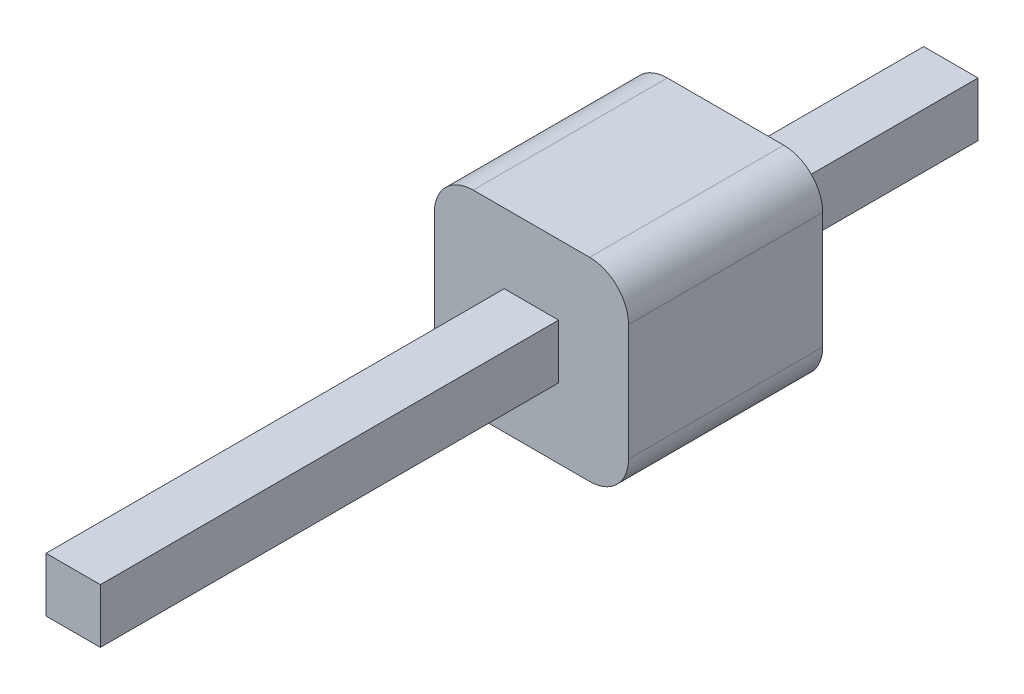
ISO-10303-21;
HEADER;
FILE_DESCRIPTION(('STEP AP214'),'2;1');
FILE_NAME('part.step','',(''),(''),'','','');
FILE_SCHEMA(('AUTOMOTIVE_DESIGN { 1 0 10303 214 1 1 1 1 }'));
ENDSEC;
DATA;
#1=APPLICATION_CONTEXT('core data for automotive mechanical design processes');
#2=APPLICATION_PROTOCOL_DEFINITION('international standard','automotive_design',2000,#1);
#3=PRODUCT_CONTEXT('',#1,'mechanical');
#4=PRODUCT('Part','Part','',(#3));
#5=PRODUCT_RELATED_PRODUCT_CATEGORY('part','',(#4));
#6=PRODUCT_DEFINITION_FORMATION('','',#4);
#7=PRODUCT_DEFINITION_CONTEXT('part definition',#1,'design');
#8=PRODUCT_DEFINITION('design','',#6,#7);
#9=PRODUCT_DEFINITION_SHAPE('','',#8);
#10=(LENGTH_UNIT() NAMED_UNIT(*) SI_UNIT(.MILLI.,.METRE.));
#11=(NAMED_UNIT(*) PLANE_ANGLE_UNIT() SI_UNIT($,.RADIAN.));
#12=(NAMED_UNIT(*) SI_UNIT($,.STERADIAN.) SOLID_ANGLE_UNIT());
#13=UNCERTAINTY_MEASURE_WITH_UNIT(LENGTH_MEASURE(1.E-05),#10,'distance_accuracy_value','');
#14=(GEOMETRIC_REPRESENTATION_CONTEXT(3) GLOBAL_UNCERTAINTY_ASSIGNED_CONTEXT((#13)) GLOBAL_UNIT_ASSIGNED_CONTEXT((#10,
#11,#12)) REPRESENTATION_CONTEXT('',''));
#15=CARTESIAN_POINT('',(0.,0.,0.));
#16=DIRECTION('',(0.,0.,1.));
#17=DIRECTION('',(1.,0.,0.));
#18=AXIS2_PLACEMENT_3D('',#15,#16,#17);
#19=CARTESIAN_POINT('',(-0.35,-0.35,11.3));
#20=DIRECTION('',(1.,0.,0.));
#21=DIRECTION('',(0.,0.,-1.));
#22=AXIS2_PLACEMENT_3D('',#19,#20,#21);
#23=PLANE('',#22);
#24=DIRECTION('',(0.,1.,0.));
#25=VECTOR('',#24,1.);
#26=CARTESIAN_POINT('',(-0.35,-0.35,5.4));
#27=LINE('',#26,#25);
#28=CARTESIAN_POINT('',(-0.35,-0.35,5.4));
#29=VERTEX_POINT('',#28);
#30=CARTESIAN_POINT('',(-0.35,0.35,5.4));
#31=VERTEX_POINT('',#30);
#32=EDGE_CURVE('E11',#29,#31,#27,.T.);
#33=ORIENTED_EDGE('',*,*,#32,.F.);
#34=DIRECTION('',(0.,0.,-1.));
#35=VECTOR('',#34,1.);
#36=CARTESIAN_POINT('',(-0.35,-0.35,11.3));
#37=LINE('',#36,#35);
#38=CARTESIAN_POINT('',(-0.35,-0.35,11.3));
#39=VERTEX_POINT('',#38);
#40=EDGE_CURVE('E24',#39,#29,#37,.T.);
#41=ORIENTED_EDGE('',*,*,#40,.F.);
#42=DIRECTION('',(0.,-1.,0.));
#43=VECTOR('',#42,1.);
#44=CARTESIAN_POINT('',(-0.35,-0.35,11.3));
#45=LINE('',#44,#43);
#46=CARTESIAN_POINT('',(-0.35,0.35,11.3));
#47=VERTEX_POINT('',#46);
#48=EDGE_CURVE('E253',#47,#39,#45,.T.);
#49=ORIENTED_EDGE('',*,*,#48,.F.);
#50=DIRECTION('',(0.,0.,-1.));
#51=VECTOR('',#50,1.);
#52=CARTESIAN_POINT('',(-0.35,0.35,11.3));
#53=LINE('',#52,#51);
#54=EDGE_CURVE('E251',#47,#31,#53,.T.);
#55=ORIENTED_EDGE('',*,*,#54,.T.);
#56=EDGE_LOOP('',(#33,#41,#49,#55));
#57=FACE_BOUND('',#56,.T.);
#58=ADVANCED_FACE('F17',(#57),#23,.F.);
#59=CARTESIAN_POINT('',(0.35,-0.35,11.3));
#60=DIRECTION('',(0.,1.,0.));
#61=DIRECTION('',(-1.,0.,0.));
#62=AXIS2_PLACEMENT_3D('',#59,#60,#61);
#63=PLANE('',#62);
#64=DIRECTION('',(-1.,0.,0.));
#65=VECTOR('',#64,1.);
#66=CARTESIAN_POINT('',(0.35,-0.35,5.4));
#67=LINE('',#66,#65);
#68=CARTESIAN_POINT('',(0.35,-0.35,5.4));
#69=VERTEX_POINT('',#68);
#70=EDGE_CURVE('E249',#69,#29,#67,.T.);
#71=ORIENTED_EDGE('',*,*,#70,.F.);
#72=DIRECTION('',(0.,0.,-1.));
#73=VECTOR('',#72,1.);
#74=CARTESIAN_POINT('',(0.35,-0.35,11.3));
#75=LINE('',#74,#73);
#76=CARTESIAN_POINT('',(0.35,-0.35,11.3));
#77=VERTEX_POINT('',#76);
#78=EDGE_CURVE('E246',#77,#69,#75,.T.);
#79=ORIENTED_EDGE('',*,*,#78,.F.);
#80=DIRECTION('',(1.,0.,0.));
#81=VECTOR('',#80,1.);
#82=CARTESIAN_POINT('',(0.35,-0.35,11.3));
#83=LINE('',#82,#81);
#84=EDGE_CURVE('E243',#39,#77,#83,.T.);
#85=ORIENTED_EDGE('',*,*,#84,.F.);
#86=ORIENTED_EDGE('',*,*,#40,.T.);
#87=EDGE_LOOP('',(#71,#79,#85,#86));
#88=FACE_BOUND('',#87,.T.);
#89=ADVANCED_FACE('F257',(#88),#63,.F.);
#90=CARTESIAN_POINT('',(0.35,-0.35,11.3));
#91=DIRECTION('',(-1.,0.,0.));
#92=DIRECTION('',(0.,0.,1.));
#93=AXIS2_PLACEMENT_3D('',#90,#91,#92);
#94=PLANE('',#93);
#95=DIRECTION('',(0.,-1.,0.));
#96=VECTOR('',#95,1.);
#97=CARTESIAN_POINT('',(0.35,-0.35,5.4));
#98=LINE('',#97,#96);
#99=CARTESIAN_POINT('',(0.35,0.35,5.4));
#100=VERTEX_POINT('',#99);
#101=EDGE_CURVE('E240',#100,#69,#98,.T.);
#102=ORIENTED_EDGE('',*,*,#101,.F.);
#103=DIRECTION('',(0.,0.,-1.));
#104=VECTOR('',#103,1.);
#105=CARTESIAN_POINT('',(0.35,0.35,11.3));
#106=LINE('',#105,#104);
#107=CARTESIAN_POINT('',(0.35,0.35,11.3));
#108=VERTEX_POINT('',#107);
#109=EDGE_CURVE('E237',#108,#100,#106,.T.);
#110=ORIENTED_EDGE('',*,*,#109,.F.);
#111=DIRECTION('',(0.,1.,0.));
#112=VECTOR('',#111,1.);
#113=CARTESIAN_POINT('',(0.35,-0.35,11.3));
#114=LINE('',#113,#112);
#115=EDGE_CURVE('E234',#77,#108,#114,.T.);
#116=ORIENTED_EDGE('',*,*,#115,.F.);
#117=ORIENTED_EDGE('',*,*,#78,.T.);
#118=EDGE_LOOP('',(#102,#110,#116,#117));
#119=FACE_BOUND('',#118,.T.);
#120=ADVANCED_FACE('F261',(#119),#94,.F.);
#121=CARTESIAN_POINT('',(0.35,0.35,11.3));
#122=DIRECTION('',(0.,-1.,0.));
#123=DIRECTION('',(1.,0.,0.));
#124=AXIS2_PLACEMENT_3D('',#121,#122,#123);
#125=PLANE('',#124);
#126=DIRECTION('',(1.,0.,0.));
#127=VECTOR('',#126,1.);
#128=CARTESIAN_POINT('',(0.35,0.35,5.4));
#129=LINE('',#128,#127);
#130=EDGE_CURVE('E232',#31,#100,#129,.T.);
#131=ORIENTED_EDGE('',*,*,#130,.F.);
#132=ORIENTED_EDGE('',*,*,#54,.F.);
#133=DIRECTION('',(-1.,0.,0.));
#134=VECTOR('',#133,1.);
#135=CARTESIAN_POINT('',(0.35,0.35,11.3));
#136=LINE('',#135,#134);
#137=EDGE_CURVE('E229',#108,#47,#136,.T.);
#138=ORIENTED_EDGE('',*,*,#137,.F.);
#139=ORIENTED_EDGE('',*,*,#109,.T.);
#140=EDGE_LOOP('',(#131,#132,#138,#139));
#141=FACE_BOUND('',#140,.T.);
#142=ADVANCED_FACE('F265',(#141),#125,.F.);
#143=CARTESIAN_POINT('',(0.,0.,11.3));
#144=DIRECTION('',(0.,0.,1.));
#145=DIRECTION('',(1.,0.,0.));
#146=AXIS2_PLACEMENT_3D('',#143,#144,#145);
#147=PLANE('',#146);
#148=ORIENTED_EDGE('',*,*,#48,.T.);
#149=ORIENTED_EDGE('',*,*,#84,.T.);
#150=ORIENTED_EDGE('',*,*,#115,.T.);
#151=ORIENTED_EDGE('',*,*,#137,.T.);
#152=EDGE_LOOP('',(#148,#149,#150,#151));
#153=FACE_BOUND('',#152,.T.);
#154=ADVANCED_FACE('F268',(#153),#147,.T.);
#155=CARTESIAN_POINT('',(0.,0.,5.4));
#156=DIRECTION('',(0.,0.,-1.));
#157=DIRECTION('',(-1.,0.,0.));
#158=AXIS2_PLACEMENT_3D('',#155,#156,#157);
#159=PLANE('',#158);
#160=DIRECTION('',(0.,1.,0.));
#161=VECTOR('',#160,1.);
#162=CARTESIAN_POINT('',(-1.25,-1.25,5.4));
#163=LINE('',#162,#161);
#164=CARTESIAN_POINT('',(-1.25,-0.75,5.4));
#165=VERTEX_POINT('',#164);
#166=CARTESIAN_POINT('',(-1.25,0.75,5.4));
#167=VERTEX_POINT('',#166);
#168=EDGE_CURVE('E227',#165,#167,#163,.T.);
#169=ORIENTED_EDGE('',*,*,#168,.F.);
#170=CARTESIAN_POINT('',(-0.75,-0.75,5.4));
#171=DIRECTION('',(0.,0.,1.));
#172=DIRECTION('',(-1.,0.,0.));
#173=AXIS2_PLACEMENT_3D('',#170,#171,#172);
#174=CIRCLE('',#173,0.5);
#175=CARTESIAN_POINT('',(-0.75,-1.25,5.4));
#176=VERTEX_POINT('',#175);
#177=EDGE_CURVE('E225',#165,#176,#174,.T.);
#178=ORIENTED_EDGE('',*,*,#177,.T.);
#179=DIRECTION('',(-1.,0.,0.));
#180=VECTOR('',#179,1.);
#181=CARTESIAN_POINT('',(-1.25,-1.25,5.4));
#182=LINE('',#181,#180);
#183=CARTESIAN_POINT('',(0.75,-1.25,5.4));
#184=VERTEX_POINT('',#183);
#185=EDGE_CURVE('E222',#184,#176,#182,.T.);
#186=ORIENTED_EDGE('',*,*,#185,.F.);
#187=CARTESIAN_POINT('',(0.75,-0.75,5.4));
#188=DIRECTION('',(0.,0.,1.));
#189=DIRECTION('',(-1.,0.,0.));
#190=AXIS2_PLACEMENT_3D('',#187,#188,#189);
#191=CIRCLE('',#190,0.5);
#192=CARTESIAN_POINT('',(1.25,-0.75,5.4));
#193=VERTEX_POINT('',#192);
#194=EDGE_CURVE('E220',#184,#193,#191,.T.);
#195=ORIENTED_EDGE('',*,*,#194,.T.);
#196=DIRECTION('',(0.,-1.,0.));
#197=VECTOR('',#196,1.);
#198=CARTESIAN_POINT('',(1.25,-1.25,5.4));
#199=LINE('',#198,#197);
#200=CARTESIAN_POINT('',(1.25,0.75,5.4));
#201=VERTEX_POINT('',#200);
#202=EDGE_CURVE('E217',#201,#193,#199,.T.);
#203=ORIENTED_EDGE('',*,*,#202,.F.);
#204=CARTESIAN_POINT('',(0.75,0.75,5.4));
#205=DIRECTION('',(0.,0.,1.));
#206=DIRECTION('',(-1.,0.,0.));
#207=AXIS2_PLACEMENT_3D('',#204,#205,#206);
#208=CIRCLE('',#207,0.5);
#209=CARTESIAN_POINT('',(0.75,1.25,5.4));
#210=VERTEX_POINT('',#209);
#211=EDGE_CURVE('E215',#201,#210,#208,.T.);
#212=ORIENTED_EDGE('',*,*,#211,.T.);
#213=DIRECTION('',(1.,0.,0.));
#214=VECTOR('',#213,1.);
#215=CARTESIAN_POINT('',(-1.25,1.25,5.4));
#216=LINE('',#215,#214);
#217=CARTESIAN_POINT('',(-0.75,1.25,5.4));
#218=VERTEX_POINT('',#217);
#219=EDGE_CURVE('E212',#218,#210,#216,.T.);
#220=ORIENTED_EDGE('',*,*,#219,.F.);
#221=CARTESIAN_POINT('',(-0.75,0.75,5.4));
#222=DIRECTION('',(0.,0.,1.));
#223=DIRECTION('',(-1.,0.,0.));
#224=AXIS2_PLACEMENT_3D('',#221,#222,#223);
#225=CIRCLE('',#224,0.5);
#226=EDGE_CURVE('E209',#218,#167,#225,.T.);
#227=ORIENTED_EDGE('',*,*,#226,.T.);
#228=EDGE_LOOP('',(#169,#178,#186,#195,#203,#212,#220,#227));
#229=FACE_BOUND('',#228,.T.);
#230=ORIENTED_EDGE('',*,*,#70,.T.);
#231=ORIENTED_EDGE('',*,*,#32,.T.);
#232=ORIENTED_EDGE('',*,*,#130,.T.);
#233=ORIENTED_EDGE('',*,*,#101,.T.);
#234=EDGE_LOOP('',(#230,#231,#232,#233));
#235=FACE_BOUND('',#234,.T.);
#236=ADVANCED_FACE('F258',(#229,#235),#159,.F.);
#237=CARTESIAN_POINT('',(0.,0.,2.9));
#238=DIRECTION('',(0.,0.,-1.));
#239=DIRECTION('',(-1.,0.,0.));
#240=AXIS2_PLACEMENT_3D('',#237,#238,#239);
#241=PLANE('',#240);
#242=DIRECTION('',(-1.,0.,0.));
#243=VECTOR('',#242,1.);
#244=CARTESIAN_POINT('',(-1.25,-1.25,2.9));
#245=LINE('',#244,#243);
#246=CARTESIAN_POINT('',(0.75,-1.25,2.9));
#247=VERTEX_POINT('',#246);
#248=CARTESIAN_POINT('',(-0.75,-1.25,2.9));
#249=VERTEX_POINT('',#248);
#250=EDGE_CURVE('E207',#247,#249,#245,.T.);
#251=ORIENTED_EDGE('',*,*,#250,.T.);
#252=CARTESIAN_POINT('',(-0.75,-0.75,2.9));
#253=DIRECTION('',(0.,0.,-1.));
#254=DIRECTION('',(-1.,0.,0.));
#255=AXIS2_PLACEMENT_3D('',#252,#253,#254);
#256=CIRCLE('',#255,0.5);
#257=CARTESIAN_POINT('',(-1.25,-0.75,2.9));
#258=VERTEX_POINT('',#257);
#259=EDGE_CURVE('E205',#249,#258,#256,.T.);
#260=ORIENTED_EDGE('',*,*,#259,.T.);
#261=DIRECTION('',(0.,1.,0.));
#262=VECTOR('',#261,1.);
#263=CARTESIAN_POINT('',(-1.25,-1.25,2.9));
#264=LINE('',#263,#262);
#265=CARTESIAN_POINT('',(-1.25,0.75,2.9));
#266=VERTEX_POINT('',#265);
#267=EDGE_CURVE('E203',#258,#266,#264,.T.);
#268=ORIENTED_EDGE('',*,*,#267,.T.);
#269=CARTESIAN_POINT('',(-0.75,0.75,2.9));
#270=DIRECTION('',(0.,0.,-1.));
#271=DIRECTION('',(-1.,0.,0.));
#272=AXIS2_PLACEMENT_3D('',#269,#270,#271);
#273=CIRCLE('',#272,0.5);
#274=CARTESIAN_POINT('',(-0.75,1.25,2.9));
#275=VERTEX_POINT('',#274);
#276=EDGE_CURVE('E201',#266,#275,#273,.T.);
#277=ORIENTED_EDGE('',*,*,#276,.T.);
#278=DIRECTION('',(1.,0.,0.));
#279=VECTOR('',#278,1.);
#280=CARTESIAN_POINT('',(-1.25,1.25,2.9));
#281=LINE('',#280,#279);
#282=CARTESIAN_POINT('',(0.75,1.25,2.9));
#283=VERTEX_POINT('',#282);
#284=EDGE_CURVE('E199',#275,#283,#281,.T.);
#285=ORIENTED_EDGE('',*,*,#284,.T.);
#286=CARTESIAN_POINT('',(0.75,0.75,2.9));
#287=DIRECTION('',(0.,0.,-1.));
#288=DIRECTION('',(-1.,0.,0.));
#289=AXIS2_PLACEMENT_3D('',#286,#287,#288);
#290=CIRCLE('',#289,0.5);
#291=CARTESIAN_POINT('',(1.25,0.75,2.9));
#292=VERTEX_POINT('',#291);
#293=EDGE_CURVE('E197',#283,#292,#290,.T.);
#294=ORIENTED_EDGE('',*,*,#293,.T.);
#295=DIRECTION('',(0.,-1.,0.));
#296=VECTOR('',#295,1.);
#297=CARTESIAN_POINT('',(1.25,-1.25,2.9));
#298=LINE('',#297,#296);
#299=CARTESIAN_POINT('',(1.25,-0.75,2.9));
#300=VERTEX_POINT('',#299);
#301=EDGE_CURVE('E195',#292,#300,#298,.T.);
#302=ORIENTED_EDGE('',*,*,#301,.T.);
#303=CARTESIAN_POINT('',(0.75,-0.75,2.9));
#304=DIRECTION('',(0.,0.,-1.));
#305=DIRECTION('',(-1.,0.,0.));
#306=AXIS2_PLACEMENT_3D('',#303,#304,#305);
#307=CIRCLE('',#306,0.5);
#308=EDGE_CURVE('E192',#300,#247,#307,.T.);
#309=ORIENTED_EDGE('',*,*,#308,.T.);
#310=EDGE_LOOP('',(#251,#260,#268,#277,#285,#294,#302,#309));
#311=FACE_BOUND('',#310,.T.);
#312=DIRECTION('',(0.,1.,0.));
#313=VECTOR('',#312,1.);
#314=CARTESIAN_POINT('',(-0.35,-0.35,2.9));
#315=LINE('',#314,#313);
#316=CARTESIAN_POINT('',(-0.35,-0.35,2.9));
#317=VERTEX_POINT('',#316);
#318=CARTESIAN_POINT('',(-0.35,0.35,2.9));
#319=VERTEX_POINT('',#318);
#320=EDGE_CURVE('E190',#317,#319,#315,.T.);
#321=ORIENTED_EDGE('',*,*,#320,.F.);
#322=DIRECTION('',(-1.,0.,0.));
#323=VECTOR('',#322,1.);
#324=CARTESIAN_POINT('',(0.35,-0.35,2.9));
#325=LINE('',#324,#323);
#326=CARTESIAN_POINT('',(0.35,-0.35,2.9));
#327=VERTEX_POINT('',#326);
#328=EDGE_CURVE('E188',#327,#317,#325,.T.);
#329=ORIENTED_EDGE('',*,*,#328,.F.);
#330=DIRECTION('',(0.,-1.,0.));
#331=VECTOR('',#330,1.);
#332=CARTESIAN_POINT('',(0.35,-0.35,2.9));
#333=LINE('',#332,#331);
#334=CARTESIAN_POINT('',(0.35,0.35,2.9));
#335=VERTEX_POINT('',#334);
#336=EDGE_CURVE('E149',#335,#327,#333,.T.);
#337=ORIENTED_EDGE('',*,*,#336,.F.);
#338=DIRECTION('',(1.,0.,0.));
#339=VECTOR('',#338,1.);
#340=CARTESIAN_POINT('',(0.35,0.35,2.9));
#341=LINE('',#340,#339);
#342=EDGE_CURVE('E184',#319,#335,#341,.T.);
#343=ORIENTED_EDGE('',*,*,#342,.F.);
#344=EDGE_LOOP('',(#321,#329,#337,#343));
#345=FACE_BOUND('',#344,.T.);
#346=ADVANCED_FACE('F285',(#311,#345),#241,.T.);
#347=CARTESIAN_POINT('',(1.25,-1.25,5.4));
#348=DIRECTION('',(1.,0.,0.));
#349=DIRECTION('',(0.,0.,-1.));
#350=AXIS2_PLACEMENT_3D('',#347,#348,#349);
#351=PLANE('',#350);
#352=ORIENTED_EDGE('',*,*,#301,.F.);
#353=DIRECTION('',(0.,0.,1.));
#354=VECTOR('',#353,1.);
#355=CARTESIAN_POINT('',(1.25,0.75,5.4));
#356=LINE('',#355,#354);
#357=EDGE_CURVE('E181',#292,#201,#356,.T.);
#358=ORIENTED_EDGE('',*,*,#357,.T.);
#359=ORIENTED_EDGE('',*,*,#202,.T.);
#360=DIRECTION('',(0.,0.,-1.));
#361=VECTOR('',#360,1.);
#362=CARTESIAN_POINT('',(1.25,-0.75,5.4));
#363=LINE('',#362,#361);
#364=EDGE_CURVE('E178',#193,#300,#363,.T.);
#365=ORIENTED_EDGE('',*,*,#364,.T.);
#366=EDGE_LOOP('',(#352,#358,#359,#365));
#367=FACE_BOUND('',#366,.T.);
#368=ADVANCED_FACE('F289',(#367),#351,.T.);
#369=CARTESIAN_POINT('',(-1.25,1.25,5.4));
#370=DIRECTION('',(0.,1.,0.));
#371=DIRECTION('',(0.,0.,1.));
#372=AXIS2_PLACEMENT_3D('',#369,#370,#371);
#373=PLANE('',#372);
#374=ORIENTED_EDGE('',*,*,#284,.F.);
#375=DIRECTION('',(0.,0.,1.));
#376=VECTOR('',#375,1.);
#377=CARTESIAN_POINT('',(-0.75,1.25,5.4));
#378=LINE('',#377,#376);
#379=EDGE_CURVE('E175',#275,#218,#378,.T.);
#380=ORIENTED_EDGE('',*,*,#379,.T.);
#381=ORIENTED_EDGE('',*,*,#219,.T.);
#382=DIRECTION('',(0.,0.,-1.));
#383=VECTOR('',#382,1.);
#384=CARTESIAN_POINT('',(0.75,1.25,5.4));
#385=LINE('',#384,#383);
#386=EDGE_CURVE('E172',#210,#283,#385,.T.);
#387=ORIENTED_EDGE('',*,*,#386,.T.);
#388=EDGE_LOOP('',(#374,#380,#381,#387));
#389=FACE_BOUND('',#388,.T.);
#390=ADVANCED_FACE('F293',(#389),#373,.T.);
#391=CARTESIAN_POINT('',(-1.25,-1.25,5.4));
#392=DIRECTION('',(-1.,0.,0.));
#393=DIRECTION('',(0.,0.,1.));
#394=AXIS2_PLACEMENT_3D('',#391,#392,#393);
#395=PLANE('',#394);
#396=ORIENTED_EDGE('',*,*,#267,.F.);
#397=DIRECTION('',(0.,0.,1.));
#398=VECTOR('',#397,1.);
#399=CARTESIAN_POINT('',(-1.25,-0.75,5.4));
#400=LINE('',#399,#398);
#401=EDGE_CURVE('E169',#258,#165,#400,.T.);
#402=ORIENTED_EDGE('',*,*,#401,.T.);
#403=ORIENTED_EDGE('',*,*,#168,.T.);
#404=DIRECTION('',(0.,0.,-1.));
#405=VECTOR('',#404,1.);
#406=CARTESIAN_POINT('',(-1.25,0.75,5.4));
#407=LINE('',#406,#405);
#408=EDGE_CURVE('E166',#167,#266,#407,.T.);
#409=ORIENTED_EDGE('',*,*,#408,.T.);
#410=EDGE_LOOP('',(#396,#402,#403,#409));
#411=FACE_BOUND('',#410,.T.);
#412=ADVANCED_FACE('F297',(#411),#395,.T.);
#413=CARTESIAN_POINT('',(-1.25,-1.25,5.4));
#414=DIRECTION('',(0.,-1.,0.));
#415=DIRECTION('',(1.,0.,0.));
#416=AXIS2_PLACEMENT_3D('',#413,#414,#415);
#417=PLANE('',#416);
#418=ORIENTED_EDGE('',*,*,#185,.T.);
#419=DIRECTION('',(0.,0.,-1.));
#420=VECTOR('',#419,1.);
#421=CARTESIAN_POINT('',(-0.75,-1.25,5.4));
#422=LINE('',#421,#420);
#423=EDGE_CURVE('E163',#176,#249,#422,.T.);
#424=ORIENTED_EDGE('',*,*,#423,.T.);
#425=ORIENTED_EDGE('',*,*,#250,.F.);
#426=DIRECTION('',(0.,0.,1.));
#427=VECTOR('',#426,1.);
#428=CARTESIAN_POINT('',(0.75,-1.25,5.4));
#429=LINE('',#428,#427);
#430=EDGE_CURVE('E160',#247,#184,#429,.T.);
#431=ORIENTED_EDGE('',*,*,#430,.T.);
#432=EDGE_LOOP('',(#418,#424,#425,#431));
#433=FACE_BOUND('',#432,.T.);
#434=ADVANCED_FACE('F301',(#433),#417,.T.);
#435=CARTESIAN_POINT('',(0.,0.,0.));
#436=DIRECTION('',(0.,0.,1.));
#437=DIRECTION('',(1.,0.,0.));
#438=AXIS2_PLACEMENT_3D('',#435,#436,#437);
#439=PLANE('',#438);
#440=DIRECTION('',(0.,-1.,0.));
#441=VECTOR('',#440,1.);
#442=CARTESIAN_POINT('',(-0.35,-0.35,0.));
#443=LINE('',#442,#441);
#444=CARTESIAN_POINT('',(-0.35,0.35,0.));
#445=VERTEX_POINT('',#444);
#446=CARTESIAN_POINT('',(-0.35,-0.35,0.));
#447=VERTEX_POINT('',#446);
#448=EDGE_CURVE('E158',#445,#447,#443,.T.);
#449=ORIENTED_EDGE('',*,*,#448,.F.);
#450=DIRECTION('',(-1.,0.,0.));
#451=VECTOR('',#450,1.);
#452=CARTESIAN_POINT('',(0.35,0.35,0.));
#453=LINE('',#452,#451);
#454=CARTESIAN_POINT('',(0.35,0.35,0.));
#455=VERTEX_POINT('',#454);
#456=EDGE_CURVE('E132',#455,#445,#453,.T.);
#457=ORIENTED_EDGE('',*,*,#456,.F.);
#458=DIRECTION('',(0.,1.,0.));
#459=VECTOR('',#458,1.);
#460=CARTESIAN_POINT('',(0.35,-0.35,0.));
#461=LINE('',#460,#459);
#462=CARTESIAN_POINT('',(0.35,-0.35,0.));
#463=VERTEX_POINT('',#462);
#464=EDGE_CURVE('E126',#463,#455,#461,.T.);
#465=ORIENTED_EDGE('',*,*,#464,.F.);
#466=DIRECTION('',(1.,0.,0.));
#467=VECTOR('',#466,1.);
#468=CARTESIAN_POINT('',(0.35,-0.35,0.));
#469=LINE('',#468,#467);
#470=EDGE_CURVE('E129',#447,#463,#469,.T.);
#471=ORIENTED_EDGE('',*,*,#470,.F.);
#472=EDGE_LOOP('',(#449,#457,#465,#471));
#473=FACE_BOUND('',#472,.T.);
#474=ADVANCED_FACE('F128',(#473),#439,.F.);
#475=CARTESIAN_POINT('',(0.35,0.35,11.3));
#476=DIRECTION('',(0.,-1.,0.));
#477=DIRECTION('',(1.,0.,0.));
#478=AXIS2_PLACEMENT_3D('',#475,#476,#477);
#479=PLANE('',#478);
#480=DIRECTION('',(0.,0.,-1.));
#481=VECTOR('',#480,1.);
#482=CARTESIAN_POINT('',(-0.35,0.35,11.3));
#483=LINE('',#482,#481);
#484=EDGE_CURVE('E145',#319,#445,#483,.T.);
#485=ORIENTED_EDGE('',*,*,#484,.F.);
#486=ORIENTED_EDGE('',*,*,#342,.T.);
#487=DIRECTION('',(0.,0.,-1.));
#488=VECTOR('',#487,1.);
#489=CARTESIAN_POINT('',(0.35,0.35,11.3));
#490=LINE('',#489,#488);
#491=EDGE_CURVE('E150',#335,#455,#490,.T.);
#492=ORIENTED_EDGE('',*,*,#491,.T.);
#493=ORIENTED_EDGE('',*,*,#456,.T.);
#494=EDGE_LOOP('',(#485,#486,#492,#493));
#495=FACE_BOUND('',#494,.T.);
#496=ADVANCED_FACE('F308',(#495),#479,.F.);
#497=CARTESIAN_POINT('',(0.35,-0.35,11.3));
#498=DIRECTION('',(-1.,0.,0.));
#499=DIRECTION('',(0.,0.,1.));
#500=AXIS2_PLACEMENT_3D('',#497,#498,#499);
#501=PLANE('',#500);
#502=ORIENTED_EDGE('',*,*,#491,.F.);
#503=ORIENTED_EDGE('',*,*,#336,.T.);
#504=DIRECTION('',(0.,0.,-1.));
#505=VECTOR('',#504,1.);
#506=CARTESIAN_POINT('',(0.35,-0.35,11.3));
#507=LINE('',#506,#505);
#508=EDGE_CURVE('E142',#327,#463,#507,.T.);
#509=ORIENTED_EDGE('',*,*,#508,.T.);
#510=ORIENTED_EDGE('',*,*,#464,.T.);
#511=EDGE_LOOP('',(#502,#503,#509,#510));
#512=FACE_BOUND('',#511,.T.);
#513=ADVANCED_FACE('F148',(#512),#501,.F.);
#514=CARTESIAN_POINT('',(0.35,-0.35,11.3));
#515=DIRECTION('',(0.,1.,0.));
#516=DIRECTION('',(-1.,0.,0.));
#517=AXIS2_PLACEMENT_3D('',#514,#515,#516);
#518=PLANE('',#517);
#519=ORIENTED_EDGE('',*,*,#508,.F.);
#520=ORIENTED_EDGE('',*,*,#328,.T.);
#521=DIRECTION('',(0.,0.,-1.));
#522=VECTOR('',#521,1.);
#523=CARTESIAN_POINT('',(-0.35,-0.35,11.3));
#524=LINE('',#523,#522);
#525=EDGE_CURVE('E144',#317,#447,#524,.T.);
#526=ORIENTED_EDGE('',*,*,#525,.T.);
#527=ORIENTED_EDGE('',*,*,#470,.T.);
#528=EDGE_LOOP('',(#519,#520,#526,#527));
#529=FACE_BOUND('',#528,.T.);
#530=ADVANCED_FACE('F140',(#529),#518,.F.);
#531=CARTESIAN_POINT('',(-0.35,-0.35,11.3));
#532=DIRECTION('',(1.,0.,0.));
#533=DIRECTION('',(0.,0.,-1.));
#534=AXIS2_PLACEMENT_3D('',#531,#532,#533);
#535=PLANE('',#534);
#536=ORIENTED_EDGE('',*,*,#525,.F.);
#537=ORIENTED_EDGE('',*,*,#320,.T.);
#538=ORIENTED_EDGE('',*,*,#484,.T.);
#539=ORIENTED_EDGE('',*,*,#448,.T.);
#540=EDGE_LOOP('',(#536,#537,#538,#539));
#541=FACE_BOUND('',#540,.T.);
#542=ADVANCED_FACE('F316',(#541),#535,.F.);
#543=CARTESIAN_POINT('',(-0.75,-0.75,5.4));
#544=DIRECTION('',(0.,0.,-1.));
#545=DIRECTION('',(-1.,0.,0.));
#546=AXIS2_PLACEMENT_3D('',#543,#544,#545);
#547=CYLINDRICAL_SURFACE('',#546,0.5);
#548=ORIENTED_EDGE('',*,*,#177,.F.);
#549=ORIENTED_EDGE('',*,*,#401,.F.);
#550=ORIENTED_EDGE('',*,*,#259,.F.);
#551=ORIENTED_EDGE('',*,*,#423,.F.);
#552=EDGE_LOOP('',(#548,#549,#550,#551));
#553=FACE_BOUND('',#552,.T.);
#554=ADVANCED_FACE('F319',(#553),#547,.T.);
#555=CARTESIAN_POINT('',(-0.75,0.75,5.4));
#556=DIRECTION('',(0.,0.,-1.));
#557=DIRECTION('',(-1.,0.,0.));
#558=AXIS2_PLACEMENT_3D('',#555,#556,#557);
#559=CYLINDRICAL_SURFACE('',#558,0.5);
#560=ORIENTED_EDGE('',*,*,#226,.F.);
#561=ORIENTED_EDGE('',*,*,#379,.F.);
#562=ORIENTED_EDGE('',*,*,#276,.F.);
#563=ORIENTED_EDGE('',*,*,#408,.F.);
#564=EDGE_LOOP('',(#560,#561,#562,#563));
#565=FACE_BOUND('',#564,.T.);
#566=ADVANCED_FACE('F323',(#565),#559,.T.);
#567=CARTESIAN_POINT('',(0.75,0.75,5.4));
#568=DIRECTION('',(0.,0.,-1.));
#569=DIRECTION('',(-1.,0.,0.));
#570=AXIS2_PLACEMENT_3D('',#567,#568,#569);
#571=CYLINDRICAL_SURFACE('',#570,0.5);
#572=ORIENTED_EDGE('',*,*,#211,.F.);
#573=ORIENTED_EDGE('',*,*,#357,.F.);
#574=ORIENTED_EDGE('',*,*,#293,.F.);
#575=ORIENTED_EDGE('',*,*,#386,.F.);
#576=EDGE_LOOP('',(#572,#573,#574,#575));
#577=FACE_BOUND('',#576,.T.);
#578=ADVANCED_FACE('F327',(#577),#571,.T.);
#579=CARTESIAN_POINT('',(0.75,-0.75,5.4));
#580=DIRECTION('',(0.,0.,-1.));
#581=DIRECTION('',(-1.,0.,0.));
#582=AXIS2_PLACEMENT_3D('',#579,#580,#581);
#583=CYLINDRICAL_SURFACE('',#582,0.5);
#584=ORIENTED_EDGE('',*,*,#194,.F.);
#585=ORIENTED_EDGE('',*,*,#430,.F.);
#586=ORIENTED_EDGE('',*,*,#308,.F.);
#587=ORIENTED_EDGE('',*,*,#364,.F.);
#588=EDGE_LOOP('',(#584,#585,#586,#587));
#589=FACE_BOUND('',#588,.T.);
#590=ADVANCED_FACE('F331',(#589),#583,.T.);
#591=CLOSED_SHELL('',(#58,#89,#120,#142,#154,#236,#346,#368,#390,#412,#434,#474,#496,#513,#530,
#542,#554,#566,#578,#590));
#592=MANIFOLD_SOLID_BREP('B1',#591);
#593=ADVANCED_BREP_SHAPE_REPRESENTATION('',(#18,#592),#14);
#594=SHAPE_DEFINITION_REPRESENTATION(#9,#593);
ENDSEC;
END-ISO-10303-21;
